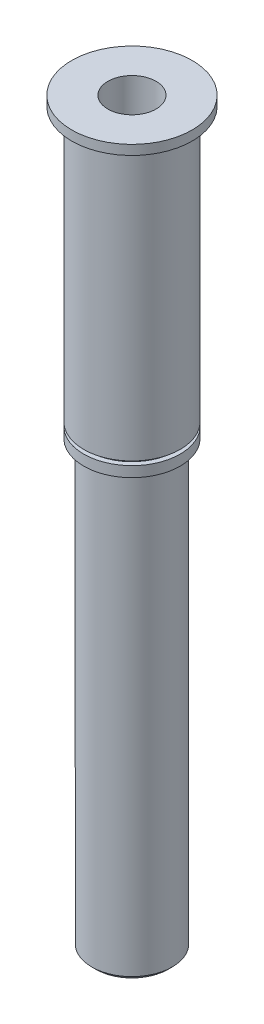
ISO-10303-21;
HEADER;
FILE_DESCRIPTION(('STEP AP214'),'2;1');
FILE_NAME('part.step','',(''),(''),'','','');
FILE_SCHEMA(('AUTOMOTIVE_DESIGN { 1 0 10303 214 1 1 1 1 }'));
ENDSEC;
DATA;
#1=APPLICATION_CONTEXT('core data for automotive mechanical design processes');
#2=APPLICATION_PROTOCOL_DEFINITION('international standard','automotive_design',2000,#1);
#3=PRODUCT_CONTEXT('',#1,'mechanical');
#4=PRODUCT('Part','Part','',(#3));
#5=PRODUCT_RELATED_PRODUCT_CATEGORY('part','',(#4));
#6=PRODUCT_DEFINITION_FORMATION('','',#4);
#7=PRODUCT_DEFINITION_CONTEXT('part definition',#1,'design');
#8=PRODUCT_DEFINITION('design','',#6,#7);
#9=PRODUCT_DEFINITION_SHAPE('','',#8);
#10=(LENGTH_UNIT() NAMED_UNIT(*) SI_UNIT(.MILLI.,.METRE.));
#11=(NAMED_UNIT(*) PLANE_ANGLE_UNIT() SI_UNIT($,.RADIAN.));
#12=(NAMED_UNIT(*) SI_UNIT($,.STERADIAN.) SOLID_ANGLE_UNIT());
#13=UNCERTAINTY_MEASURE_WITH_UNIT(LENGTH_MEASURE(1.E-05),#10,'distance_accuracy_value','');
#14=(GEOMETRIC_REPRESENTATION_CONTEXT(3) GLOBAL_UNCERTAINTY_ASSIGNED_CONTEXT((#13)) GLOBAL_UNIT_ASSIGNED_CONTEXT((#10,
#11,#12)) REPRESENTATION_CONTEXT('',''));
#15=CARTESIAN_POINT('',(0.,0.,0.));
#16=DIRECTION('',(0.,0.,1.));
#17=DIRECTION('',(1.,0.,0.));
#18=AXIS2_PLACEMENT_3D('',#15,#16,#17);
#19=CARTESIAN_POINT('',(0.,54.4532386267546,0.));
#20=DIRECTION('',(0.,1.,0.));
#21=DIRECTION('',(0.,0.,1.));
#22=AXIS2_PLACEMENT_3D('',#19,#20,#21);
#23=CYLINDRICAL_SURFACE('',#22,5.99999999999999);
#24=CARTESIAN_POINT('',(-5.45435605731785,24.9338834926435,-2.50000000000002));
#25=CARTESIAN_POINT('',(-5.45435734054167,24.8671753094886,-2.4999985002592));
#26=CARTESIAN_POINT('',(-5.45558543290004,24.8004487004749,-2.49732449538885));
#27=CARTESIAN_POINT('',(-5.46045125759508,24.6674970142405,-2.48666416485579));
#28=CARTESIAN_POINT('',(-5.46409042196581,24.6012722587484,-2.47867468210202));
#29=CARTESIAN_POINT('',(-5.47848490817202,24.4038316258729,-2.44679265931586));
#30=CARTESIAN_POINT('',(-5.49271671920562,24.274046676214,-2.4149868340824));
#31=CARTESIAN_POINT('',(-5.52853615769555,24.0227287285122,-2.33180001337601));
#32=CARTESIAN_POINT('',(-5.55009376241037,23.9011644405519,-2.28049881438591));
#33=CARTESIAN_POINT('',(-5.59808356001869,23.6683733160865,-2.16001268934728));
#34=CARTESIAN_POINT('',(-5.62451459938574,23.5571440426667,-2.09083199376533));
#35=CARTESIAN_POINT('',(-5.68111508149859,23.3412295105541,-1.93194778443698));
#36=CARTESIAN_POINT('',(-5.71141131571834,23.2372676955961,-1.84130648149059));
#37=CARTESIAN_POINT('',(-5.77128595332679,23.0454837274691,-1.64404334636728));
#38=CARTESIAN_POINT('',(-5.80086407614999,22.9576677971324,-1.53741538134829));
#39=CARTESIAN_POINT('',(-5.85751074553439,22.7969842371149,-1.30552678905517));
#40=CARTESIAN_POINT('',(-5.88441479600862,22.7249301847621,-1.17965858775789));
#41=CARTESIAN_POINT('',(-5.93113040336417,22.6033315034261,-0.916264044334358));
#42=CARTESIAN_POINT('',(-5.95094510785637,22.5537768822461,-0.778742909642287));
#43=CARTESIAN_POINT('',(-5.98035041998161,22.4812045623031,-0.503536996147035));
#44=CARTESIAN_POINT('',(-5.99041942231787,22.4569400994103,-0.366233152418039));
#45=CARTESIAN_POINT('',(-6.00093657245547,22.4316082137515,-0.0891583607042157));
#46=CARTESIAN_POINT('',(-6.0013886226806,22.4305313817693,0.050611563535715));
#47=CARTESIAN_POINT('',(-5.99290258260449,22.4509520536727,0.319585560218764));
#48=CARTESIAN_POINT('',(-5.98453429295771,22.4710796934703,0.448914977212854));
#49=CARTESIAN_POINT('',(-5.96013033502178,22.5309896981444,0.702165787864578));
#50=CARTESIAN_POINT('',(-5.94409410149724,22.5707735119647,0.826086782110337));
#51=CARTESIAN_POINT('',(-5.90559704827464,22.669339574371,1.06727623615435));
#52=CARTESIAN_POINT('',(-5.88304194251415,22.7284024183677,1.18441435414909));
#53=CARTESIAN_POINT('',(-5.83371427980367,22.8635750060615,1.40742353456466));
#54=CARTESIAN_POINT('',(-5.80694023334939,22.9396907743413,1.51329059551617));
#55=CARTESIAN_POINT('',(-5.74963397551503,23.1130483334443,1.71868182341337));
#56=CARTESIAN_POINT('',(-5.7189698870208,23.2114010751864,1.81723287462325));
#57=CARTESIAN_POINT('',(-5.65875721372881,23.4233063740716,1.99686282986469));
#58=CARTESIAN_POINT('',(-5.62920906299895,23.5368647692792,2.07793499168333));
#59=CARTESIAN_POINT('',(-5.57363224672079,23.7806735659233,2.22280378497071));
#60=CARTESIAN_POINT('',(-5.54775116967599,23.911349903949,2.28594506698408));
#61=CARTESIAN_POINT('',(-5.50419688296714,24.182845582406,2.3889286410397));
#62=CARTESIAN_POINT('',(-5.48651780631496,24.3236575891278,2.42878759251231));
#63=CARTESIAN_POINT('',(-5.46282425074785,24.6016771105105,2.48160050339174));
#64=CARTESIAN_POINT('',(-5.45612738403678,24.738525737172,2.49613229266529));
#65=CARTESIAN_POINT('',(-5.45320573611835,25.0128404574561,2.50251261037223));
#66=CARTESIAN_POINT('',(-5.45697733196176,25.1503063210242,2.49436898636085));
#67=CARTESIAN_POINT('',(-5.47386262693787,25.4126802635069,2.45706955131293));
#68=CARTESIAN_POINT('',(-5.48636276033849,25.5378288662178,2.42929237636154));
#69=CARTESIAN_POINT('',(-5.51851260594274,25.7815860856387,2.3553411712841));
#70=CARTESIAN_POINT('',(-5.53816398920145,25.9001931663051,2.30916284106234));
#71=CARTESIAN_POINT('',(-5.58341595714171,26.1331141133563,2.19755041610379));
#72=CARTESIAN_POINT('',(-5.60923324404616,26.2470334418629,2.13138366612398));
#73=CARTESIAN_POINT('',(-5.66360007481534,26.4626995976429,1.98240156877202));
#74=CARTESIAN_POINT('',(-5.69215079841126,26.5644411260522,1.89957901575215));
#75=CARTESIAN_POINT('',(-5.75157239569095,26.7614837624061,1.71168891143062));
#76=CARTESIAN_POINT('',(-5.78244293417775,26.8555862925239,1.60535932295837));
#77=CARTESIAN_POINT('',(-5.84086722367757,27.0248280766232,1.37770302510817));
#78=CARTESIAN_POINT('',(-5.86842073153693,27.0999659408494,1.25637521761131));
#79=CARTESIAN_POINT('',(-5.91728503171621,27.229063243452,1.00130936160266));
#80=CARTESIAN_POINT('',(-5.93857966278874,27.2829679749283,0.867540339261858));
#81=CARTESIAN_POINT('',(-5.97236346205513,27.3671170776063,0.591717670323918));
#82=CARTESIAN_POINT('',(-5.98485787035282,27.3973755301925,0.449669008506732));
#83=CARTESIAN_POINT('',(-5.99903069599259,27.4315997426639,0.172033066960335));
#84=CARTESIAN_POINT('',(-6.00140409083761,27.4372554883535,0.036688169398396));
#85=CARTESIAN_POINT('',(-5.996990469466,27.4266572137388,-0.232973623239271));
#86=CARTESIAN_POINT('',(-5.99020505911643,27.4104070343296,-0.367290694377513));
#87=CARTESIAN_POINT('',(-5.96860132018429,27.3576713351008,-0.626172965578211));
#88=CARTESIAN_POINT('',(-5.95407648620172,27.3219240831677,-0.750915078182074));
#89=CARTESIAN_POINT('',(-5.91858999492375,27.2320150467711,-0.992584458507236));
#90=CARTESIAN_POINT('',(-5.89762711496349,27.1778497642853,-1.10951023666913));
#91=CARTESIAN_POINT('',(-5.85011651583377,27.0499042450643,-1.33804914068054));
#92=CARTESIAN_POINT('',(-5.82335921372402,26.9753481691304,-1.44918335299793));
#93=CARTESIAN_POINT('',(-5.76743120752482,26.8098698478327,-1.6578373142191));
#94=CARTESIAN_POINT('',(-5.73825960968075,26.7189415268074,-1.7553519850411));
#95=CARTESIAN_POINT('',(-5.67829702479813,26.5159909625714,-1.94089972242287));
#96=CARTESIAN_POINT('',(-5.64753091772373,26.4029543806135,-2.02783607699347));
#97=CARTESIAN_POINT('',(-5.58991059036394,26.1629771006427,-2.18166607575466));
#98=CARTESIAN_POINT('',(-5.56305856115973,26.0360286839761,-2.24854851583743));
#99=CARTESIAN_POINT('',(-5.51685287460302,25.771954559284,-2.35965744264201));
#100=CARTESIAN_POINT('',(-5.49745949216628,25.6348875374939,-2.40400437258689));
#101=CARTESIAN_POINT('',(-5.47594959049771,25.4247197235771,-2.45239925350766));
#102=CARTESIAN_POINT('',(-5.47004503557764,25.3539728946874,-2.46550603347794));
#103=CARTESIAN_POINT('',(-5.46095373466213,25.2114574362249,-2.4855813094392));
#104=CARTESIAN_POINT('',(-5.45776506941947,25.1396895647209,-2.49255414024396));
#105=CARTESIAN_POINT('',(-5.45490391727667,25.0231718870044,-2.49880479670827));
#106=CARTESIAN_POINT('',(-5.45435519844582,24.9785318169701,-2.50000100378863));
#107=CARTESIAN_POINT('',(-5.45435605731785,24.9338834926435,-2.50000000000002));
#108=B_SPLINE_CURVE_WITH_KNOTS('',3,(#24,#25,#26,#27,#28,#29,#30,#31,#32,#33,#34,#35,#36,#37,
#38,#39,#40,#41,#42,#43,#44,#45,#46,#47,#48,#49,#50,#51,#52,#53,#54,#55,#56,#57,#58,#59,#60,#61,
#62,#63,#64,#65,#66,#67,#68,#69,#70,#71,#72,#73,#74,#75,#76,#77,#78,#79,#80,#81,#82,#83,#84,#85,
#86,#87,#88,#89,#90,#91,#92,#93,#94,#95,#96,#97,#98,#99,#100,#101,#102,#103,#104,#105,#106,
#107),.UNSPECIFIED.,.T.,.F.,(4,2,2,2,2,2,2,2,2,2,2,2,2,2,2,2,2,2,2,2,2,2,2,2,2,2,2,2,2,2,2,2,2,
2,2,2,2,2,2,2,2,4),(0.,0.200084575093031,0.400288095243565,0.801278994956872,1.20064597557674,
1.59991854837273,2.02172149988557,2.44368668047066,2.88395420283092,3.32402600677027,
3.74119679083149,4.15819828963104,4.54982147617427,4.94147353531009,5.33910096407375,
5.73686909172213,6.16267530816215,6.58864548009984,7.02861558463916,7.46827048625632,
7.8794002374711,8.29038772171394,8.67506269266882,9.05982760961557,9.46088720770836,
9.8621206872543,10.2960179260553,10.7299469521823,11.1649867904569,11.5997673642051,
12.0041573732261,12.4084764873832,12.7984529720747,13.1885035639884,13.5961819279257,
14.004011892323,14.4395932095166,14.8754174341574,15.3088871873109,15.5252058174741,
15.7413714538653,15.8752896716762),.UNSPECIFIED.);
#109=CARTESIAN_POINT('',(-5.45435605731785,24.9338834926435,-2.50000000000002));
#110=VERTEX_POINT('',#109);
#111=EDGE_CURVE('E65',#110,#110,#108,.T.);
#112=ORIENTED_EDGE('',*,*,#111,.F.);
#113=EDGE_LOOP('',(#112));
#114=FACE_BOUND('',#113,.T.);
#115=CARTESIAN_POINT('',(0.,38.7338834926435,0.));
#116=DIRECTION('',(0.,1.,0.));
#117=DIRECTION('',(0.,0.,1.));
#118=AXIS2_PLACEMENT_3D('',#115,#116,#117);
#119=CIRCLE('',#118,5.99999999999999);
#120=CARTESIAN_POINT('',(0.,38.7338834926435,5.99999999999999));
#121=VERTEX_POINT('',#120);
#122=EDGE_CURVE('E139',#121,#121,#119,.F.);
#123=ORIENTED_EDGE('',*,*,#122,.T.);
#124=EDGE_LOOP('',(#123));
#125=FACE_BOUND('',#124,.T.);
#126=CARTESIAN_POINT('',(0.,4.73388349264347,0.));
#127=DIRECTION('',(0.,-1.,0.));
#128=DIRECTION('',(0.,0.,-1.));
#129=AXIS2_PLACEMENT_3D('',#126,#127,#128);
#130=CIRCLE('',#129,5.99999999999999);
#131=CARTESIAN_POINT('',(0.,4.73388349264347,-5.99999999999999));
#132=VERTEX_POINT('',#131);
#133=EDGE_CURVE('E142',#132,#132,#130,.F.);
#134=ORIENTED_EDGE('',*,*,#133,.T.);
#135=EDGE_LOOP('',(#134));
#136=FACE_BOUND('',#135,.T.);
#137=ADVANCED_FACE('F36',(#114,#125,#136),#23,.T.);
#138=CARTESIAN_POINT('',(0.,38.7338834926435,0.));
#139=DIRECTION('',(0.,1.,0.));
#140=DIRECTION('',(0.,0.,1.));
#141=AXIS2_PLACEMENT_3D('',#138,#139,#140);
#142=CYLINDRICAL_SURFACE('',#141,7.5);
#143=CARTESIAN_POINT('',(0.,38.7338834926435,0.));
#144=DIRECTION('',(0.,1.,0.));
#145=DIRECTION('',(0.,0.,1.));
#146=AXIS2_PLACEMENT_3D('',#143,#144,#145);
#147=CIRCLE('',#146,7.5);
#148=CARTESIAN_POINT('',(0.,38.7338834926435,7.5));
#149=VERTEX_POINT('',#148);
#150=EDGE_CURVE('E164',#149,#149,#147,.T.);
#151=ORIENTED_EDGE('',*,*,#150,.T.);
#152=EDGE_LOOP('',(#151));
#153=FACE_BOUND('',#152,.T.);
#154=CARTESIAN_POINT('',(0.,39.9338834926435,0.));
#155=DIRECTION('',(0.,1.,0.));
#156=DIRECTION('',(0.,0.,1.));
#157=AXIS2_PLACEMENT_3D('',#154,#155,#156);
#158=CIRCLE('',#157,7.5);
#159=CARTESIAN_POINT('',(0.,39.9338834926435,7.49999999999997));
#160=VERTEX_POINT('',#159);
#161=EDGE_CURVE('E147',#160,#160,#158,.T.);
#162=ORIENTED_EDGE('',*,*,#161,.F.);
#163=EDGE_LOOP('',(#162));
#164=FACE_BOUND('',#163,.T.);
#165=ADVANCED_FACE('F103',(#153,#164),#142,.T.);
#166=CARTESIAN_POINT('',(0.,38.7338834926435,0.));
#167=DIRECTION('',(0.,1.,0.));
#168=DIRECTION('',(0.,0.,1.));
#169=AXIS2_PLACEMENT_3D('',#166,#167,#168);
#170=PLANE('',#169);
#171=ORIENTED_EDGE('',*,*,#122,.F.);
#172=EDGE_LOOP('',(#171));
#173=FACE_BOUND('',#172,.T.);
#174=ORIENTED_EDGE('',*,*,#150,.F.);
#175=EDGE_LOOP('',(#174));
#176=FACE_BOUND('',#175,.T.);
#177=ADVANCED_FACE('F99',(#173,#176),#170,.F.);
#178=CARTESIAN_POINT('',(-3.,14.9338834926435,0.));
#179=DIRECTION('',(0.,1.,0.));
#180=DIRECTION('',(0.,0.,1.));
#181=AXIS2_PLACEMENT_3D('',#178,#179,#180);
#182=PLANE('',#181);
#183=CARTESIAN_POINT('',(0.,14.9338834926435,0.));
#184=DIRECTION('',(0.,1.,0.));
#185=DIRECTION('',(0.,0.,1.));
#186=AXIS2_PLACEMENT_3D('',#183,#184,#185);
#187=CIRCLE('',#186,3.);
#188=CARTESIAN_POINT('',(0.,14.9338834926435,3.));
#189=VERTEX_POINT('',#188);
#190=EDGE_CURVE('E157',#189,#189,#187,.T.);
#191=ORIENTED_EDGE('',*,*,#190,.T.);
#192=EDGE_LOOP('',(#191));
#193=FACE_BOUND('',#192,.T.);
#194=ADVANCED_FACE('F102',(#193),#182,.T.);
#195=CARTESIAN_POINT('',(0.,54.4532386267546,0.));
#196=DIRECTION('',(0.,1.,0.));
#197=DIRECTION('',(0.,0.,1.));
#198=AXIS2_PLACEMENT_3D('',#195,#196,#197);
#199=CYLINDRICAL_SURFACE('',#198,3.);
#200=CARTESIAN_POINT('',(-1.65831239517771,24.9338834926435,-2.5));
#201=CARTESIAN_POINT('',(-1.65832848527754,25.0221879028291,-2.49999381779273));
#202=CARTESIAN_POINT('',(-1.6655210686777,25.1106432786533,-2.49526266006818));
#203=CARTESIAN_POINT('',(-1.69279627564282,25.2846613765462,-2.47682990119856));
#204=CARTESIAN_POINT('',(-1.71292318814639,25.3702130923286,-2.46309747522162));
#205=CARTESIAN_POINT('',(-1.77233115678601,25.5689888032858,-2.42086856120707));
#206=CARTESIAN_POINT('',(-1.81601359579234,25.6800751471308,-2.3887114612382));
#207=CARTESIAN_POINT('',(-1.91336767201457,25.8930613092186,-2.31147102501766));
#208=CARTESIAN_POINT('',(-1.96707143083862,25.9949299772965,-2.26634586338956));
#209=CARTESIAN_POINT('',(-2.06331280338908,26.1629291066556,-2.17847435315541));
#210=CARTESIAN_POINT('',(-2.10482488185015,26.2311450839987,-2.13852895219287));
#211=CARTESIAN_POINT('',(-2.18866644492372,26.3631705930408,-2.05264418187197));
#212=CARTESIAN_POINT('',(-2.23099627404099,26.426978213381,-2.00670223718889));
#213=CARTESIAN_POINT('',(-2.35727388143594,26.611640260247,-1.86006177209498));
#214=CARTESIAN_POINT('',(-2.44068431676978,26.7260201250674,-1.75039822318646));
#215=CARTESIAN_POINT('',(-2.58108364411646,26.9124774984321,-1.5333123609528));
#216=CARTESIAN_POINT('',(-2.63992409122054,26.9883817152232,-1.43034863494403));
#217=CARTESIAN_POINT('',(-2.74775790284002,27.1252205500356,-1.21027306497039));
#218=CARTESIAN_POINT('',(-2.79676719280151,27.1861794141541,-1.0931846025589));
#219=CARTESIAN_POINT('',(-2.8737292379046,27.2809963577162,-0.867930574105461));
#220=CARTESIAN_POINT('',(-2.9038573073085,27.3177174572991,-0.761720558967917));
#221=CARTESIAN_POINT('',(-2.95260382616351,27.3768639023298,-0.542834165009168));
#222=CARTESIAN_POINT('',(-2.97122890852623,27.3992974865515,-0.430161553726259));
#223=CARTESIAN_POINT('',(-2.99549160197877,27.4284849882888,-0.200906197669838));
#224=CARTESIAN_POINT('',(-3.00107488956408,27.435173322391,-0.0843091426466134));
#225=CARTESIAN_POINT('',(-2.99858143529683,27.4321812475282,0.148527393661028));
#226=CARTESIAN_POINT('',(-2.9905049960565,27.4225012011818,0.264766882809668));
#227=CARTESIAN_POINT('',(-2.96241335973366,27.3886692430998,0.485446031322572));
#228=CARTESIAN_POINT('',(-2.94323594516173,27.3655323747977,0.590154005534411));
#229=CARTESIAN_POINT('',(-2.89501312358898,27.3069356614111,0.793626256853953));
#230=CARTESIAN_POINT('',(-2.8659663010323,27.2714740485883,0.892389678949247));
#231=CARTESIAN_POINT('',(-2.79690305459727,27.1862923211923,1.09053364635435));
#232=CARTESIAN_POINT('',(-2.7561606192345,27.1356117234793,1.18924374927734));
#233=CARTESIAN_POINT('',(-2.66744762527377,27.0234867997065,1.37677917974559));
#234=CARTESIAN_POINT('',(-2.61947057552116,26.962032799232,1.4655955045331));
#235=CARTESIAN_POINT('',(-2.49448789391341,26.7984241681692,1.67280381279719));
#236=CARTESIAN_POINT('',(-2.41452783856823,26.6908122692457,1.78517417530476));
#237=CARTESIAN_POINT('',(-2.29203945368862,26.5166431899206,1.93670187620859));
#238=CARTESIAN_POINT('',(-2.25072631897239,26.4563693243366,1.98442734415749));
#239=CARTESIAN_POINT('',(-2.16828375986478,26.3316117071543,2.07418694298426));
#240=CARTESIAN_POINT('',(-2.12715427459333,26.2671294816486,2.11622312017874));
#241=CARTESIAN_POINT('',(-2.02736013921568,26.1027648881694,2.2128283312648));
#242=CARTESIAN_POINT('',(-1.96948181657995,26.0004198932096,2.26407571910769));
#243=CARTESIAN_POINT('',(-1.86213853666704,25.7860223211063,2.35314050085773));
#244=CARTESIAN_POINT('',(-1.81264991817818,25.6739984370167,2.39099600305924));
#245=CARTESIAN_POINT('',(-1.74376607660698,25.4780630401315,2.44141089540612));
#246=CARTESIAN_POINT('',(-1.71981949257389,25.3968847423602,2.45819358164976));
#247=CARTESIAN_POINT('',(-1.68277668804556,25.2309223469688,2.48370273222158));
#248=CARTESIAN_POINT('',(-1.6696549602013,25.1461472237485,2.49244814091895));
#249=CARTESIAN_POINT('',(-1.65659310081948,24.9744557860731,2.50115517387014));
#250=CARTESIAN_POINT('',(-1.65674814862677,24.8875284779761,2.50105337364501));
#251=CARTESIAN_POINT('',(-1.67045143445771,24.71517780513,2.49191597272537));
#252=CARTESIAN_POINT('',(-1.68401821733779,24.6297566895134,2.4828680018572));
#253=CARTESIAN_POINT('',(-1.72679886038485,24.4416990353045,2.45336046117377));
#254=CARTESIAN_POINT('',(-1.75909755109199,24.3401585241388,2.43059717465));
#255=CARTESIAN_POINT('',(-1.83446297156767,24.1442510462441,2.37422567983521));
#256=CARTESIAN_POINT('',(-1.87756517999221,24.0499090779508,2.34058163140776));
#257=CARTESIAN_POINT('',(-1.95968409590123,23.8878887093502,2.27197464095646));
#258=CARTESIAN_POINT('',(-1.99758766640245,23.8188377528957,2.23884949579972));
#259=CARTESIAN_POINT('',(-2.07535316303075,23.6848549954358,2.16695951166952));
#260=CARTESIAN_POINT('',(-2.11521609327308,23.6199253463698,2.12819176063919));
#261=CARTESIAN_POINT('',(-2.19562728957064,23.4940495868169,2.04513177456929));
#262=CARTESIAN_POINT('',(-2.2361760916142,23.4331067918795,2.00083502832497));
#263=CARTESIAN_POINT('',(-2.31689068931581,23.3152985435429,1.90679633939309));
#264=CARTESIAN_POINT('',(-2.35705627447801,23.2584352304251,1.85705157250685));
#265=CARTESIAN_POINT('',(-2.47761126043929,23.0914286574604,1.69691470794622));
#266=CARTESIAN_POINT('',(-2.55601135420393,22.987945953924,1.57762869702065));
#267=CARTESIAN_POINT('',(-2.6636899482228,22.8491628595828,1.38213833429728));
#268=CARTESIAN_POINT('',(-2.6979035366431,22.8056729631294,1.31428144251984));
#269=CARTESIAN_POINT('',(-2.76217044277535,22.7247667516098,1.17320567310926));
#270=CARTESIAN_POINT('',(-2.79222622145716,22.6873468414902,1.09999000687008));
#271=CARTESIAN_POINT('',(-2.85642765987159,22.6079661429999,0.923231349702236));
#272=CARTESIAN_POINT('',(-2.88858366145246,22.5686666685771,0.817729906619372));
#273=CARTESIAN_POINT('',(-2.94156350531489,22.5042472443929,0.599797532910335));
#274=CARTESIAN_POINT('',(-2.96239616816157,22.479116257205,0.48737207212835));
#275=CARTESIAN_POINT('',(-2.99113754779354,22.4445063407984,0.257904014589405));
#276=CARTESIAN_POINT('',(-2.99898403281668,22.4351027775599,0.140841922250393));
#277=CARTESIAN_POINT('',(-3.00082959064105,22.4328878611151,-0.0935504369182539));
#278=CARTESIAN_POINT('',(-2.99482967474112,22.4400752961529,-0.210880683537447));
#279=CARTESIAN_POINT('',(-2.97047572120601,22.4693785396626,-0.433478999214042));
#280=CARTESIAN_POINT('',(-2.95305281328288,22.4903695294022,-0.539003381840986));
#281=CARTESIAN_POINT('',(-2.90807057508891,22.5449273449073,-0.744442226622884));
#282=CARTESIAN_POINT('',(-2.88050965969777,22.5784961372806,-0.84435580868807));
#283=CARTESIAN_POINT('',(-2.81464343863442,22.6595006479255,-1.04384055152989));
#284=CARTESIAN_POINT('',(-2.77570403743572,22.7077652647482,-1.14286172854007));
#285=CARTESIAN_POINT('',(-2.69039800671959,22.8150884255271,-1.33135097301227));
#286=CARTESIAN_POINT('',(-2.64402565415892,22.8741552917164,-1.42081159008169));
#287=CARTESIAN_POINT('',(-2.52264851028667,23.0319272402692,-1.63002558091951));
#288=CARTESIAN_POINT('',(-2.44452820472336,23.1361098493924,-1.7439051194505));
#289=CARTESIAN_POINT('',(-2.32413331941845,23.3050372219198,-1.89807730985012));
#290=CARTESIAN_POINT('',(-2.28340098508498,23.3635547931417,-1.94675534900056));
#291=CARTESIAN_POINT('',(-2.20183068446826,23.4847249623695,-2.03855478653206));
#292=CARTESIAN_POINT('',(-2.16099275466,23.5473762788008,-2.08167789496711));
#293=CARTESIAN_POINT('',(-2.05749735800433,23.7133751811559,-2.18509588569708));
#294=CARTESIAN_POINT('',(-1.9955406228512,23.8197258409898,-2.2413368587222));
#295=CARTESIAN_POINT('',(-1.87997635262038,24.0431391773541,-2.33909634990319));
#296=CARTESIAN_POINT('',(-1.82634630603952,24.1601715636994,-2.38065496503428));
#297=CARTESIAN_POINT('',(-1.75197107121736,24.3637577291061,-2.43556494992109));
#298=CARTESIAN_POINT('',(-1.72624379189049,24.4471572848451,-2.45370261757165));
#299=CARTESIAN_POINT('',(-1.68613426001941,24.6179113614695,-2.48144437754553));
#300=CARTESIAN_POINT('',(-1.67170839549461,24.7052492895762,-2.49108129246964));
#301=CARTESIAN_POINT('',(-1.66228358000328,24.816674817457,-2.4973616083669));
#302=CARTESIAN_POINT('',(-1.66079886805556,24.8400763175191,-2.49834926640794));
#303=CARTESIAN_POINT('',(-1.65881104526684,24.8869428120357,-2.49966934514003));
#304=CARTESIAN_POINT('',(-1.6583081176342,24.9104078175229,-2.50000164353614));
#305=CARTESIAN_POINT('',(-1.65831239517771,24.9338834926435,-2.5));
#306=B_SPLINE_CURVE_WITH_KNOTS('',3,(#200,#201,#202,#203,#204,#205,#206,#207,#208,#209,#210,
#211,#212,#213,#214,#215,#216,#217,#218,#219,#220,#221,#222,#223,#224,#225,#226,#227,#228,#229,
#230,#231,#232,#233,#234,#235,#236,#237,#238,#239,#240,#241,#242,#243,#244,#245,#246,#247,#248,
#249,#250,#251,#252,#253,#254,#255,#256,#257,#258,#259,#260,#261,#262,#263,#264,#265,#266,#267,
#268,#269,#270,#271,#272,#273,#274,#275,#276,#277,#278,#279,#280,#281,#282,#283,#284,#285,#286,
#287,#288,#289,#290,#291,#292,#293,#294,#295,#296,#297,#298,#299,#300,#301,#302,#303,#304,#305),
.UNSPECIFIED.,.T.,.F.,(4,2,2,2,2,2,2,2,2,2,2,2,2,2,2,2,2,2,2,2,2,2,2,2,2,2,2,2,2,2,2,2,2,2,2,2,
2,2,2,2,2,2,2,2,2,2,2,2,2,2,2,2,4),(0.,0.26480748684394,0.530526577859093,0.899311711113838,
1.26929988428685,1.5368427188706,1.804500834995,2.33872733232366,2.75963734355702,
3.1798599185264,3.52745225260386,3.87484396861101,4.22368012855121,4.57250856061357,
4.89792180788511,5.22338174845507,5.5766929274979,5.93032301720734,6.45212646169798,
6.71375344417619,6.97528607349777,7.35902155845283,7.74165612186447,7.99961659145722,
8.25696746076709,8.51616339578933,8.77571823174384,9.10077852677663,9.42692063321696,
9.6829620521776,9.93913608157881,10.1955205112228,10.4520384827407,10.9775613091596,
11.2398627749288,11.5020083164191,11.8517559716834,12.2012307913941,12.5523755496758,
12.9034946622281,13.2290536025831,13.5546634671053,13.9038797714121,14.2533662599302,
14.7693582552692,15.0281495003973,15.2868608867407,15.691662084526,16.0953490806584,
16.3618811606765,16.6273795605045,16.697765340701,16.7681642541596),.UNSPECIFIED.);
#307=CARTESIAN_POINT('',(-1.65831239517771,24.9338834926435,-2.5));
#308=VERTEX_POINT('',#307);
#309=EDGE_CURVE('E40',#308,#308,#306,.T.);
#310=ORIENTED_EDGE('',*,*,#309,.F.);
#311=EDGE_LOOP('',(#310));
#312=FACE_BOUND('',#311,.T.);
#313=CARTESIAN_POINT('',(0.,39.9338834926435,0.));
#314=DIRECTION('',(0.,1.,0.));
#315=DIRECTION('',(0.,0.,1.));
#316=AXIS2_PLACEMENT_3D('',#313,#314,#315);
#317=CIRCLE('',#316,3.);
#318=CARTESIAN_POINT('',(0.,39.9338834926435,2.99999999999997));
#319=VERTEX_POINT('',#318);
#320=EDGE_CURVE('E160',#319,#319,#317,.T.);
#321=ORIENTED_EDGE('',*,*,#320,.T.);
#322=EDGE_LOOP('',(#321));
#323=FACE_BOUND('',#322,.T.);
#324=ORIENTED_EDGE('',*,*,#190,.F.);
#325=EDGE_LOOP('',(#324));
#326=FACE_BOUND('',#325,.T.);
#327=ADVANCED_FACE('F107',(#312,#323,#326),#199,.F.);
#328=CARTESIAN_POINT('',(-3.00000000000002,39.9338834926435,0.));
#329=DIRECTION('',(0.,1.,0.));
#330=DIRECTION('',(0.,0.,1.));
#331=AXIS2_PLACEMENT_3D('',#328,#329,#330);
#332=PLANE('',#331);
#333=ORIENTED_EDGE('',*,*,#320,.F.);
#334=EDGE_LOOP('',(#333));
#335=FACE_BOUND('',#334,.T.);
#336=ORIENTED_EDGE('',*,*,#161,.T.);
#337=EDGE_LOOP('',(#336));
#338=FACE_BOUND('',#337,.T.);
#339=ADVANCED_FACE('F97',(#335,#338),#332,.T.);
#340=CARTESIAN_POINT('',(0.,4.45323862675461,0.));
#341=DIRECTION('',(0.,1.,0.));
#342=DIRECTION('',(0.,0.,1.));
#343=AXIS2_PLACEMENT_3D('',#340,#341,#342);
#344=CYLINDRICAL_SURFACE('',#343,5.39999999999999);
#345=CARTESIAN_POINT('',(0.,4.23388349264347,0.));
#346=DIRECTION('',(0.,1.,0.));
#347=DIRECTION('',(0.,0.,1.));
#348=AXIS2_PLACEMENT_3D('',#345,#346,#347);
#349=CIRCLE('',#348,5.39999999999999);
#350=CARTESIAN_POINT('',(0.,4.23388349264347,5.39999999999999));
#351=VERTEX_POINT('',#350);
#352=EDGE_CURVE('E144',#351,#351,#349,.T.);
#353=ORIENTED_EDGE('',*,*,#352,.T.);
#354=EDGE_LOOP('',(#353));
#355=FACE_BOUND('',#354,.T.);
#356=CARTESIAN_POINT('',(0.,4.73388349264347,0.));
#357=DIRECTION('',(0.,1.,0.));
#358=DIRECTION('',(0.,0.,1.));
#359=AXIS2_PLACEMENT_3D('',#356,#357,#358);
#360=CIRCLE('',#359,5.4);
#361=CARTESIAN_POINT('',(0.,4.73388349264347,5.4));
#362=VERTEX_POINT('',#361);
#363=EDGE_CURVE('E74',#362,#362,#360,.T.);
#364=ORIENTED_EDGE('',*,*,#363,.F.);
#365=EDGE_LOOP('',(#364));
#366=FACE_BOUND('',#365,.T.);
#367=ADVANCED_FACE('F93',(#355,#366),#344,.T.);
#368=CARTESIAN_POINT('',(0.,4.23388349264347,6.22499999999999));
#369=DIRECTION('',(0.,1.,0.));
#370=DIRECTION('',(0.,0.,1.));
#371=AXIS2_PLACEMENT_3D('',#368,#369,#370);
#372=PLANE('',#371);
#373=CARTESIAN_POINT('',(0.,4.23388349264347,0.));
#374=DIRECTION('',(0.,1.,0.));
#375=DIRECTION('',(0.,0.,1.));
#376=AXIS2_PLACEMENT_3D('',#373,#374,#375);
#377=CIRCLE('',#376,5.99999999999999);
#378=CARTESIAN_POINT('',(0.,4.23388349264347,5.99999999999999));
#379=VERTEX_POINT('',#378);
#380=EDGE_CURVE('E143',#379,#379,#377,.F.);
#381=ORIENTED_EDGE('',*,*,#380,.F.);
#382=EDGE_LOOP('',(#381));
#383=FACE_BOUND('',#382,.T.);
#384=ORIENTED_EDGE('',*,*,#352,.F.);
#385=EDGE_LOOP('',(#384));
#386=FACE_BOUND('',#385,.T.);
#387=ADVANCED_FACE('F89',(#383,#386),#372,.T.);
#388=CARTESIAN_POINT('',(0.,4.73388349264347,5.3999999999999));
#389=DIRECTION('',(0.,-1.,0.));
#390=DIRECTION('',(0.,0.,-1.));
#391=AXIS2_PLACEMENT_3D('',#388,#389,#390);
#392=PLANE('',#391);
#393=ORIENTED_EDGE('',*,*,#133,.F.);
#394=EDGE_LOOP('',(#393));
#395=FACE_BOUND('',#394,.T.);
#396=ORIENTED_EDGE('',*,*,#363,.T.);
#397=EDGE_LOOP('',(#396));
#398=FACE_BOUND('',#397,.T.);
#399=ADVANCED_FACE('F84',(#395,#398),#392,.T.);
#400=CARTESIAN_POINT('',(-5.,-52.0661165073565,0.));
#401=DIRECTION('',(0.,-1.,0.));
#402=DIRECTION('',(0.,0.,-1.));
#403=AXIS2_PLACEMENT_3D('',#400,#401,#402);
#404=PLANE('',#403);
#405=CARTESIAN_POINT('',(0.,-52.0661165073565,0.));
#406=DIRECTION('',(0.,-1.,0.));
#407=DIRECTION('',(0.,0.,-1.));
#408=AXIS2_PLACEMENT_3D('',#405,#406,#407);
#409=CIRCLE('',#408,2.5);
#410=CARTESIAN_POINT('',(0.,-52.0661165073565,-2.5));
#411=VERTEX_POINT('',#410);
#412=EDGE_CURVE('E62',#411,#411,#409,.T.);
#413=ORIENTED_EDGE('',*,*,#412,.F.);
#414=EDGE_LOOP('',(#413));
#415=FACE_BOUND('',#414,.T.);
#416=CARTESIAN_POINT('',(0.,-52.0661165073565,0.));
#417=DIRECTION('',(0.,-1.,0.));
#418=DIRECTION('',(0.,0.,-1.));
#419=AXIS2_PLACEMENT_3D('',#416,#417,#418);
#420=CIRCLE('',#419,4.50000000000002);
#421=CARTESIAN_POINT('',(0.,-52.0661165073565,-4.50000000000002));
#422=VERTEX_POINT('',#421);
#423=EDGE_CURVE('E11',#422,#422,#420,.T.);
#424=ORIENTED_EDGE('',*,*,#423,.T.);
#425=EDGE_LOOP('',(#424));
#426=FACE_BOUND('',#425,.T.);
#427=ADVANCED_FACE('F88',(#415,#426),#404,.T.);
#428=CARTESIAN_POINT('',(0.,-51.5661165073565,0.));
#429=DIRECTION('',(0.,1.,0.));
#430=DIRECTION('',(0.,0.,1.));
#431=AXIS2_PLACEMENT_3D('',#428,#429,#430);
#432=CONICAL_SURFACE('',#431,4.99999999999999,0.785398163397431);
#433=ORIENTED_EDGE('',*,*,#423,.F.);
#434=EDGE_LOOP('',(#433));
#435=FACE_BOUND('',#434,.T.);
#436=CARTESIAN_POINT('',(0.,-51.5661165073565,0.));
#437=DIRECTION('',(0.,-1.,0.));
#438=DIRECTION('',(0.,0.,-1.));
#439=AXIS2_PLACEMENT_3D('',#436,#437,#438);
#440=CIRCLE('',#439,4.99999999999999);
#441=CARTESIAN_POINT('',(0.,-51.5661165073565,-5.00000000000002));
#442=VERTEX_POINT('',#441);
#443=EDGE_CURVE('E48',#442,#442,#440,.F.);
#444=ORIENTED_EDGE('',*,*,#443,.F.);
#445=EDGE_LOOP('',(#444));
#446=FACE_BOUND('',#445,.T.);
#447=ADVANCED_FACE('F38',(#435,#446),#432,.T.);
#448=CARTESIAN_POINT('',(0.,54.4532386267546,0.));
#449=DIRECTION('',(0.,1.,0.));
#450=DIRECTION('',(0.,0.,1.));
#451=AXIS2_PLACEMENT_3D('',#448,#449,#450);
#452=CYLINDRICAL_SURFACE('',#451,4.99999999999999);
#453=ORIENTED_EDGE('',*,*,#443,.T.);
#454=EDGE_LOOP('',(#453));
#455=FACE_BOUND('',#454,.T.);
#456=CARTESIAN_POINT('',(0.,2.93388349264347,0.));
#457=DIRECTION('',(0.,1.,0.));
#458=DIRECTION('',(0.,0.,1.));
#459=AXIS2_PLACEMENT_3D('',#456,#457,#458);
#460=CIRCLE('',#459,4.99999999999999);
#461=CARTESIAN_POINT('',(0.,2.93388349264347,4.99999999999999));
#462=VERTEX_POINT('',#461);
#463=EDGE_CURVE('E155',#462,#462,#460,.T.);
#464=ORIENTED_EDGE('',*,*,#463,.F.);
#465=EDGE_LOOP('',(#464));
#466=FACE_BOUND('',#465,.T.);
#467=ADVANCED_FACE('F118',(#455,#466),#452,.T.);
#468=CARTESIAN_POINT('',(-5.99999999999999,2.93388349264352,0.));
#469=DIRECTION('',(0.,-1.,0.));
#470=DIRECTION('',(0.,0.,-1.));
#471=AXIS2_PLACEMENT_3D('',#468,#469,#470);
#472=PLANE('',#471);
#473=ORIENTED_EDGE('',*,*,#463,.T.);
#474=EDGE_LOOP('',(#473));
#475=FACE_BOUND('',#474,.T.);
#476=CARTESIAN_POINT('',(0.,2.93388349264347,0.));
#477=DIRECTION('',(0.,1.,0.));
#478=DIRECTION('',(0.,0.,1.));
#479=AXIS2_PLACEMENT_3D('',#476,#477,#478);
#480=CIRCLE('',#479,5.99999999999999);
#481=CARTESIAN_POINT('',(0.,2.93388349264347,5.99999999999999));
#482=VERTEX_POINT('',#481);
#483=EDGE_CURVE('E152',#482,#482,#480,.T.);
#484=ORIENTED_EDGE('',*,*,#483,.F.);
#485=EDGE_LOOP('',(#484));
#486=FACE_BOUND('',#485,.T.);
#487=ADVANCED_FACE('F120',(#475,#486),#472,.T.);
#488=ORIENTED_EDGE('',*,*,#483,.T.);
#489=EDGE_LOOP('',(#488));
#490=FACE_BOUND('',#489,.T.);
#491=ORIENTED_EDGE('',*,*,#380,.T.);
#492=EDGE_LOOP('',(#491));
#493=FACE_BOUND('',#492,.T.);
#494=ADVANCED_FACE('F76',(#490,#493),#23,.T.);
#495=CARTESIAN_POINT('',(-7.5,24.9338834926435,1.11022302462516E-13));
#496=DIRECTION('',(1.,0.,0.));
#497=DIRECTION('',(0.,0.,-1.));
#498=AXIS2_PLACEMENT_3D('',#495,#496,#497);
#499=CYLINDRICAL_SURFACE('',#498,2.5);
#500=ORIENTED_EDGE('',*,*,#111,.T.);
#501=EDGE_LOOP('',(#500));
#502=FACE_BOUND('',#501,.T.);
#503=ORIENTED_EDGE('',*,*,#309,.T.);
#504=EDGE_LOOP('',(#503));
#505=FACE_BOUND('',#504,.T.);
#506=ADVANCED_FACE('F56',(#502,#505),#499,.F.);
#507=CARTESIAN_POINT('',(0.,-35.0661165073565,0.));
#508=DIRECTION('',(0.,-1.,0.));
#509=DIRECTION('',(0.,0.,-1.));
#510=AXIS2_PLACEMENT_3D('',#507,#508,#509);
#511=CONICAL_SURFACE('',#510,2.5,1.02974425867665);
#512=CARTESIAN_POINT('',(0.,-33.5639649597876,0.));
#513=VERTEX_POINT('',#512);
#514=VERTEX_LOOP('',#513);
#515=FACE_BOUND('',#514,.T.);
#516=CARTESIAN_POINT('',(0.,-35.0661165073565,0.));
#517=DIRECTION('',(0.,-1.,0.));
#518=DIRECTION('',(0.,0.,-1.));
#519=AXIS2_PLACEMENT_3D('',#516,#517,#518);
#520=CIRCLE('',#519,2.5);
#521=CARTESIAN_POINT('',(0.,-35.0661165073565,-2.5));
#522=VERTEX_POINT('',#521);
#523=EDGE_CURVE('E60',#522,#522,#520,.T.);
#524=ORIENTED_EDGE('',*,*,#523,.T.);
#525=EDGE_LOOP('',(#524));
#526=FACE_BOUND('',#525,.T.);
#527=ADVANCED_FACE('F52',(#515,#526),#511,.F.);
#528=CARTESIAN_POINT('',(0.,-52.0661165073565,0.));
#529=DIRECTION('',(0.,-1.,0.));
#530=DIRECTION('',(0.,0.,-1.));
#531=AXIS2_PLACEMENT_3D('',#528,#529,#530);
#532=CYLINDRICAL_SURFACE('',#531,2.5);
#533=ORIENTED_EDGE('',*,*,#523,.F.);
#534=EDGE_LOOP('',(#533));
#535=FACE_BOUND('',#534,.T.);
#536=ORIENTED_EDGE('',*,*,#412,.T.);
#537=EDGE_LOOP('',(#536));
#538=FACE_BOUND('',#537,.T.);
#539=ADVANCED_FACE('F55',(#535,#538),#532,.F.);
#540=CLOSED_SHELL('',(#137,#165,#177,#194,#327,#339,#367,#387,#399,#427,#447,#467,#487,#494,
#506,#527,#539));
#541=MANIFOLD_SOLID_BREP('B2',#540);
#542=ADVANCED_BREP_SHAPE_REPRESENTATION('',(#18,#541),#14);
#543=SHAPE_DEFINITION_REPRESENTATION(#9,#542);
ENDSEC;
END-ISO-10303-21;
